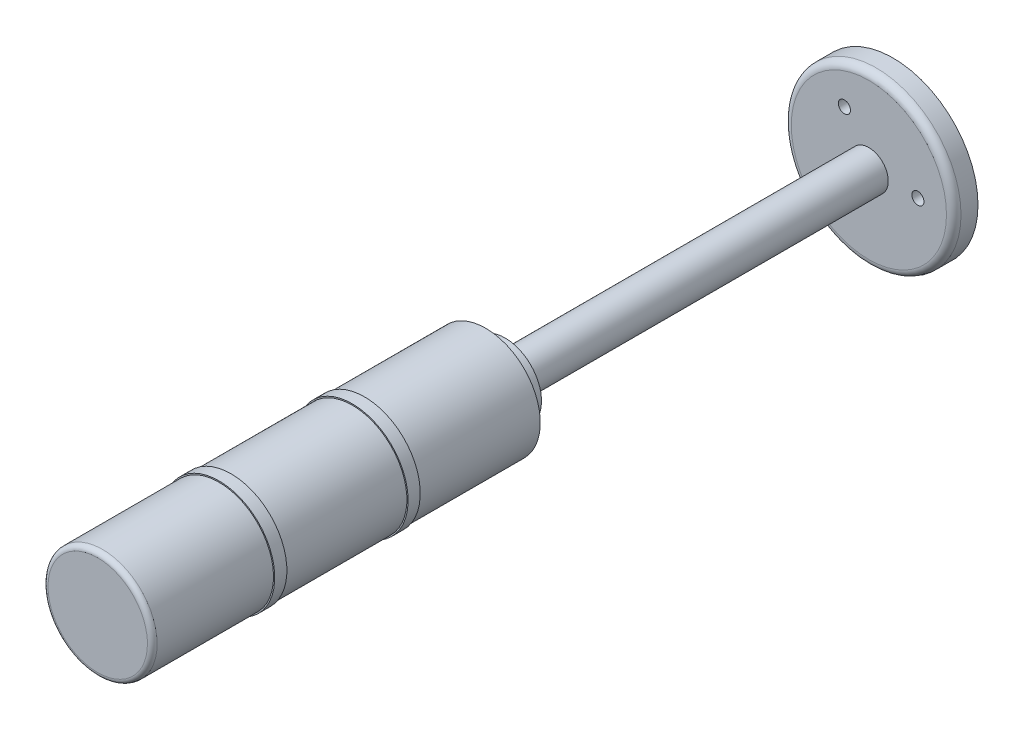
ISO-10303-21;
HEADER;
FILE_DESCRIPTION(('STEP AP214'),'2;1');
FILE_NAME('part.step','',(''),(''),'','','');
FILE_SCHEMA(('AUTOMOTIVE_DESIGN { 1 0 10303 214 1 1 1 1 }'));
ENDSEC;
DATA;
#1=APPLICATION_CONTEXT('core data for automotive mechanical design processes');
#2=APPLICATION_PROTOCOL_DEFINITION('international standard','automotive_design',2000,#1);
#3=PRODUCT_CONTEXT('',#1,'mechanical');
#4=PRODUCT('Part','Part','',(#3));
#5=PRODUCT_RELATED_PRODUCT_CATEGORY('part','',(#4));
#6=PRODUCT_DEFINITION_FORMATION('','',#4);
#7=PRODUCT_DEFINITION_CONTEXT('part definition',#1,'design');
#8=PRODUCT_DEFINITION('design','',#6,#7);
#9=PRODUCT_DEFINITION_SHAPE('','',#8);
#10=(LENGTH_UNIT() NAMED_UNIT(*) SI_UNIT(.MILLI.,.METRE.));
#11=(NAMED_UNIT(*) PLANE_ANGLE_UNIT() SI_UNIT($,.RADIAN.));
#12=(NAMED_UNIT(*) SI_UNIT($,.STERADIAN.) SOLID_ANGLE_UNIT());
#13=UNCERTAINTY_MEASURE_WITH_UNIT(LENGTH_MEASURE(1.E-05),#10,'distance_accuracy_value','');
#14=(GEOMETRIC_REPRESENTATION_CONTEXT(3) GLOBAL_UNCERTAINTY_ASSIGNED_CONTEXT((#13)) GLOBAL_UNIT_ASSIGNED_CONTEXT((#10,
#11,#12)) REPRESENTATION_CONTEXT('',''));
#15=CARTESIAN_POINT('',(0.,0.,0.));
#16=DIRECTION('',(0.,0.,1.));
#17=DIRECTION('',(1.,0.,0.));
#18=AXIS2_PLACEMENT_3D('',#15,#16,#17);
#19=CARTESIAN_POINT('',(0.,0.,-268.));
#20=DIRECTION('',(0.,0.,-1.));
#21=DIRECTION('',(-1.,0.,0.));
#22=AXIS2_PLACEMENT_3D('',#19,#20,#21);
#23=PLANE('',#22);
#24=CARTESIAN_POINT('',(-10.1036297108185,17.5,-268.));
#25=DIRECTION('',(0.,0.,-1.));
#26=DIRECTION('',(-1.,0.,0.));
#27=AXIS2_PLACEMENT_3D('',#24,#25,#26);
#28=CIRCLE('',#27,2.5);
#29=CARTESIAN_POINT('',(-12.6036297108185,17.5,-268.));
#30=VERTEX_POINT('',#29);
#31=EDGE_CURVE('E325',#30,#30,#28,.T.);
#32=ORIENTED_EDGE('',*,*,#31,.T.);
#33=EDGE_LOOP('',(#32));
#34=FACE_BOUND('',#33,.T.);
#35=CARTESIAN_POINT('',(-10.1036297108184,-17.5,-268.));
#36=DIRECTION('',(0.,0.,-1.));
#37=DIRECTION('',(-1.,0.,0.));
#38=AXIS2_PLACEMENT_3D('',#35,#36,#37);
#39=CIRCLE('',#38,2.5);
#40=CARTESIAN_POINT('',(-12.6036297108184,-17.5,-268.));
#41=VERTEX_POINT('',#40);
#42=EDGE_CURVE('E217',#41,#41,#39,.T.);
#43=ORIENTED_EDGE('',*,*,#42,.T.);
#44=EDGE_LOOP('',(#43));
#45=FACE_BOUND('',#44,.T.);
#46=CARTESIAN_POINT('',(20.2072594216369,0.,-268.));
#47=DIRECTION('',(0.,0.,-1.));
#48=DIRECTION('',(-1.,0.,0.));
#49=AXIS2_PLACEMENT_3D('',#46,#47,#48);
#50=CIRCLE('',#49,2.5);
#51=CARTESIAN_POINT('',(17.7072594216369,0.,-268.));
#52=VERTEX_POINT('',#51);
#53=EDGE_CURVE('E205',#52,#52,#50,.T.);
#54=ORIENTED_EDGE('',*,*,#53,.T.);
#55=EDGE_LOOP('',(#54));
#56=FACE_BOUND('',#55,.T.);
#57=CARTESIAN_POINT('',(0.,0.,-268.));
#58=DIRECTION('',(0.,0.,-1.));
#59=DIRECTION('',(-1.,0.,0.));
#60=AXIS2_PLACEMENT_3D('',#57,#58,#59);
#61=CIRCLE('',#60,8.);
#62=CARTESIAN_POINT('',(-8.,0.,-268.));
#63=VERTEX_POINT('',#62);
#64=EDGE_CURVE('E166',#63,#63,#61,.F.);
#65=ORIENTED_EDGE('',*,*,#64,.F.);
#66=EDGE_LOOP('',(#65));
#67=FACE_BOUND('',#66,.T.);
#68=CARTESIAN_POINT('',(0.,0.,-268.));
#69=DIRECTION('',(0.,0.,-1.));
#70=DIRECTION('',(-1.,0.,0.));
#71=AXIS2_PLACEMENT_3D('',#68,#69,#70);
#72=CIRCLE('',#71,32.);
#73=CARTESIAN_POINT('',(-32.,0.,-268.));
#74=VERTEX_POINT('',#73);
#75=CARTESIAN_POINT('',(32.,0.,-268.));
#76=VERTEX_POINT('',#75);
#77=EDGE_CURVE('E59',#74,#76,#72,.T.);
#78=ORIENTED_EDGE('',*,*,#77,.F.);
#79=CARTESIAN_POINT('',(0.,0.,-268.));
#80=DIRECTION('',(0.,0.,-1.));
#81=DIRECTION('',(1.,0.,0.));
#82=AXIS2_PLACEMENT_3D('',#79,#80,#81);
#83=CIRCLE('',#82,32.);
#84=EDGE_CURVE('E55',#76,#74,#83,.T.);
#85=ORIENTED_EDGE('',*,*,#84,.F.);
#86=EDGE_LOOP('',(#78,#85));
#87=FACE_BOUND('',#86,.T.);
#88=ADVANCED_FACE('F38',(#34,#45,#56,#67,#87),#23,.F.);
#89=CARTESIAN_POINT('',(0.,0.,-271.));
#90=DIRECTION('',(0.,0.,-1.));
#91=DIRECTION('',(-1.,0.,0.));
#92=AXIS2_PLACEMENT_3D('',#89,#90,#91);
#93=TOROIDAL_SURFACE('',#92,32.,3.);
#94=CARTESIAN_POINT('',(0.,0.,-271.));
#95=DIRECTION('',(0.,0.,1.));
#96=DIRECTION('',(1.,0.,0.));
#97=AXIS2_PLACEMENT_3D('',#94,#95,#96);
#98=CIRCLE('',#97,35.);
#99=CARTESIAN_POINT('',(35.,0.,-271.));
#100=VERTEX_POINT('',#99);
#101=EDGE_CURVE('E48',#100,#100,#98,.F.);
#102=ORIENTED_EDGE('',*,*,#101,.F.);
#103=EDGE_LOOP('',(#102));
#104=FACE_BOUND('',#103,.T.);
#105=ORIENTED_EDGE('',*,*,#77,.T.);
#106=ORIENTED_EDGE('',*,*,#84,.T.);
#107=EDGE_LOOP('',(#105,#106));
#108=FACE_BOUND('',#107,.T.);
#109=ADVANCED_FACE('F238',(#104,#108),#93,.T.);
#110=CARTESIAN_POINT('',(0.,0.,-278.));
#111=DIRECTION('',(0.,0.,1.));
#112=DIRECTION('',(1.,0.,0.));
#113=AXIS2_PLACEMENT_3D('',#110,#111,#112);
#114=CYLINDRICAL_SURFACE('',#113,35.);
#115=ORIENTED_EDGE('',*,*,#101,.T.);
#116=EDGE_LOOP('',(#115));
#117=FACE_BOUND('',#116,.T.);
#118=CARTESIAN_POINT('',(0.,0.,-278.));
#119=DIRECTION('',(0.,0.,1.));
#120=DIRECTION('',(1.,0.,0.));
#121=AXIS2_PLACEMENT_3D('',#118,#119,#120);
#122=CIRCLE('',#121,35.);
#123=CARTESIAN_POINT('',(35.,0.,-278.));
#124=VERTEX_POINT('',#123);
#125=EDGE_CURVE('E11',#124,#124,#122,.F.);
#126=ORIENTED_EDGE('',*,*,#125,.F.);
#127=EDGE_LOOP('',(#126));
#128=FACE_BOUND('',#127,.T.);
#129=ADVANCED_FACE('F233',(#117,#128),#114,.T.);
#130=CARTESIAN_POINT('',(0.,0.,-278.));
#131=DIRECTION('',(0.,0.,-1.));
#132=DIRECTION('',(-1.,0.,0.));
#133=AXIS2_PLACEMENT_3D('',#130,#131,#132);
#134=PLANE('',#133);
#135=CARTESIAN_POINT('',(-10.1036297108185,17.5,-278.));
#136=DIRECTION('',(0.,0.,-1.));
#137=DIRECTION('',(-1.,0.,0.));
#138=AXIS2_PLACEMENT_3D('',#135,#136,#137);
#139=CIRCLE('',#138,2.5);
#140=CARTESIAN_POINT('',(-12.6036297108185,17.5,-278.));
#141=VERTEX_POINT('',#140);
#142=EDGE_CURVE('E214',#141,#141,#139,.T.);
#143=ORIENTED_EDGE('',*,*,#142,.F.);
#144=EDGE_LOOP('',(#143));
#145=FACE_BOUND('',#144,.T.);
#146=CARTESIAN_POINT('',(-10.1036297108184,-17.5,-278.));
#147=DIRECTION('',(0.,0.,-1.));
#148=DIRECTION('',(-1.,0.,0.));
#149=AXIS2_PLACEMENT_3D('',#146,#147,#148);
#150=CIRCLE('',#149,2.5);
#151=CARTESIAN_POINT('',(-12.6036297108184,-17.5,-278.));
#152=VERTEX_POINT('',#151);
#153=EDGE_CURVE('E246',#152,#152,#150,.T.);
#154=ORIENTED_EDGE('',*,*,#153,.F.);
#155=EDGE_LOOP('',(#154));
#156=FACE_BOUND('',#155,.T.);
#157=CARTESIAN_POINT('',(20.2072594216369,0.,-278.));
#158=DIRECTION('',(0.,0.,-1.));
#159=DIRECTION('',(-1.,0.,0.));
#160=AXIS2_PLACEMENT_3D('',#157,#158,#159);
#161=CIRCLE('',#160,2.5);
#162=CARTESIAN_POINT('',(17.7072594216369,0.,-278.));
#163=VERTEX_POINT('',#162);
#164=EDGE_CURVE('E209',#163,#163,#161,.T.);
#165=ORIENTED_EDGE('',*,*,#164,.F.);
#166=EDGE_LOOP('',(#165));
#167=FACE_BOUND('',#166,.T.);
#168=ORIENTED_EDGE('',*,*,#125,.T.);
#169=EDGE_LOOP('',(#168));
#170=FACE_BOUND('',#169,.T.);
#171=ADVANCED_FACE('F150',(#145,#156,#167,#170),#134,.T.);
#172=CARTESIAN_POINT('',(0.,0.,50.));
#173=DIRECTION('',(0.,0.,-1.));
#174=DIRECTION('',(-1.,0.,0.));
#175=AXIS2_PLACEMENT_3D('',#172,#173,#174);
#176=PLANE('',#175);
#177=CARTESIAN_POINT('',(0.,0.,50.));
#178=DIRECTION('',(0.,0.,-1.));
#179=DIRECTION('',(0.,1.,0.));
#180=AXIS2_PLACEMENT_3D('',#177,#178,#179);
#181=CIRCLE('',#180,20.5);
#182=CARTESIAN_POINT('',(20.5,0.,50.));
#183=VERTEX_POINT('',#182);
#184=CARTESIAN_POINT('',(-20.5,0.,50.));
#185=VERTEX_POINT('',#184);
#186=EDGE_CURVE('E165',#183,#185,#181,.T.);
#187=ORIENTED_EDGE('',*,*,#186,.F.);
#188=CARTESIAN_POINT('',(-20.5,0.,50.));
#189=CARTESIAN_POINT('',(-20.5000032077772,0.274828723634129,50.));
#190=CARTESIAN_POINT('',(-20.4944734736397,0.549657223690522,50.));
#191=CARTESIAN_POINT('',(-20.4723711507077,1.09886985360395,50.));
#192=CARTESIAN_POINT('',(-20.4557985619132,1.37325398346099,50.));
#193=CARTESIAN_POINT('',(-20.4116335588393,1.92113394993181,50.));
#194=CARTESIAN_POINT('',(-20.3840411445601,2.1946297865456,50.));
#195=CARTESIAN_POINT('',(-20.3178821280162,2.74029087272713,50.));
#196=CARTESIAN_POINT('',(-20.2793155257516,3.01245612229487,50.));
#197=CARTESIAN_POINT('',(-20.1912702373858,3.5550158409908,50.));
#198=CARTESIAN_POINT('',(-20.1417915512845,3.825410310119,50.));
#199=CARTESIAN_POINT('',(-20.0320021914943,4.36399115230005,50.));
#200=CARTESIAN_POINT('',(-19.9716915178053,4.63217752535291,50.));
#201=CARTESIAN_POINT('',(-19.8403357059354,5.16590842732852,50.));
#202=CARTESIAN_POINT('',(-19.7692905677544,5.43145295625128,50.));
#203=CARTESIAN_POINT('',(-19.6165807360656,5.95947069545172,50.));
#204=CARTESIAN_POINT('',(-19.5349160425578,6.2219439057294,50.));
#205=CARTESIAN_POINT('',(-19.3610991775133,6.74339450096095,50.));
#206=CARTESIAN_POINT('',(-19.2689470059765,7.00237188591481,50.));
#207=CARTESIAN_POINT('',(-19.0743042281013,7.51641197501478,50.));
#208=CARTESIAN_POINT('',(-18.9718136217628,7.77147467916089,50.));
#209=CARTESIAN_POINT('',(-18.7566597288386,8.27727289293835,50.));
#210=CARTESIAN_POINT('',(-18.6439964422529,8.5280084025697,50.));
#211=CARTESIAN_POINT('',(-18.4086794294216,9.0247466731623,50.));
#212=CARTESIAN_POINT('',(-18.286025703176,9.27074943412356,50.));
#213=CARTESIAN_POINT('',(-18.0309260853053,9.7576244531303,50.));
#214=CARTESIAN_POINT('',(-17.8984801936801,9.99849671117579,50.));
#215=CARTESIAN_POINT('',(-17.6240108199445,10.4747207249517,50.));
#216=CARTESIAN_POINT('',(-17.4819873378341,10.7100724806822,50.));
#217=CARTESIAN_POINT('',(-17.1885911188036,11.174876445055,50.));
#218=CARTESIAN_POINT('',(-17.0372183818835,11.4043286536974,50.));
#219=CARTESIAN_POINT('',(-16.7253735639712,11.8569564590755,50.));
#220=CARTESIAN_POINT('',(-16.5649014829789,12.0801320558112,50.));
#221=CARTESIAN_POINT('',(-16.1758712570817,12.5988373727686,50.));
#222=CARTESIAN_POINT('',(-15.9435599186384,12.8915643985854,50.));
#223=CARTESIAN_POINT('',(-15.4632964892471,13.4638785036779,50.));
#224=CARTESIAN_POINT('',(-15.2153443982989,13.7434655829538,50.));
#225=CARTESIAN_POINT('',(-14.7045321879936,14.2886764162054,50.));
#226=CARTESIAN_POINT('',(-14.4416720686364,14.5543001701812,50.0000000000001));
#227=CARTESIAN_POINT('',(-13.9018312092124,15.0707875417324,49.9999999999998));
#228=CARTESIAN_POINT('',(-13.6248504691455,15.321651159308,49.9999999999994));
#229=CARTESIAN_POINT('',(-13.0575958425492,15.8078695376692,50.0000000000006));
#230=CARTESIAN_POINT('',(-12.7673219560197,16.0432242984549,50.0000000000021));
#231=CARTESIAN_POINT('',(-12.1743465756122,16.4977217673589,49.9999999999979));
#232=CARTESIAN_POINT('',(-11.8716450817341,16.7168644754773,49.999999999992));
#233=CARTESIAN_POINT('',(-11.2547258865903,17.1382823390832,50.000000000008));
#234=CARTESIAN_POINT('',(-10.9405081853245,17.3405574945708,50.0000000000298));
#235=CARTESIAN_POINT('',(-10.3014691145297,17.7276389288622,49.9999999999702));
#236=CARTESIAN_POINT('',(-9.97664774500056,17.912445207666,49.9999999998889));
#237=CARTESIAN_POINT('',(-9.46525113454908,18.1852045405983,50.0000000000612));
#238=CARTESIAN_POINT('',(-9.28199275524056,18.2794303029593,50.000000000181));
#239=CARTESIAN_POINT('',(-8.91272512287839,18.4623418606966,49.9999999992401));
#240=CARTESIAN_POINT('',(-8.72671586766524,18.5510276517235,49.9999999981793));
#241=CARTESIAN_POINT('',(-8.35211632892393,18.7227675994613,49.9999999925581));
#242=CARTESIAN_POINT('',(-8.16352603477328,18.8058217329863,49.9999999879976));
#243=CARTESIAN_POINT('',(-7.78393836090987,18.9662394131278,49.9999999651106));
#244=CARTESIAN_POINT('',(-7.59294096327831,19.0436029173532,49.999999946784));
#245=CARTESIAN_POINT('',(-7.20864769647201,19.1925352504815,49.9999999050103));
#246=CARTESIAN_POINT('',(-7.01535129901719,19.2641027168292,49.999999881562));
#247=CARTESIAN_POINT('',(-6.62666099115838,19.4012913515675,49.9999998631055));
#248=CARTESIAN_POINT('',(-6.43126708988929,19.4669125458431,49.9999998680971));
#249=CARTESIAN_POINT('',(-6.03858262834651,19.5922024957703,49.9999999002964));
#250=CARTESIAN_POINT('',(-5.84129209505342,19.6518713359602,49.9999999275037));
#251=CARTESIAN_POINT('',(-5.44495424004429,19.7650437820955,49.9999999746393));
#252=CARTESIAN_POINT('',(-5.24590696070338,19.818547536316,49.9999999945679));
#253=CARTESIAN_POINT('',(-4.92995833050387,19.8987129847978,50.0000000031598));
#254=CARTESIAN_POINT('',(-4.81352398152376,19.9272408210878,50.0000000014145));
#255=CARTESIAN_POINT('',(-4.39924743496073,20.0248977566581,49.9999999937948));
#256=CARTESIAN_POINT('',(-4.10004821342178,20.0883962774833,49.9999999857138));
#257=CARTESIAN_POINT('',(-3.57511383745618,20.1875841270118,49.9999999544758));
#258=CARTESIAN_POINT('',(-3.34993154995245,20.2262453779905,49.9999999356472));
#259=CARTESIAN_POINT('',(-2.93086266333279,20.2909506103735,49.9999999121864));
#260=CARTESIAN_POINT('',(-2.73713291855902,20.3180095346011,49.9999999059018));
#261=CARTESIAN_POINT('',(-2.33222578352696,20.3686330098142,49.9999999044886));
#262=CARTESIAN_POINT('',(-2.12098535990785,20.3916945417268,49.9999999103695));
#263=CARTESIAN_POINT('',(-1.69788991160972,20.4312137382261,49.999999926598));
#264=CARTESIAN_POINT('',(-1.48603489114465,20.4476714479842,49.9999999369456));
#265=CARTESIAN_POINT('',(-1.06191755345181,20.4739892469356,49.9999999602208));
#266=CARTESIAN_POINT('',(-0.849655240474451,20.4838494046077,49.9999999731484));
#267=CARTESIAN_POINT('',(-0.424925184543616,20.4968607422733,49.9999999922236));
#268=CARTESIAN_POINT('',(-0.212457444490631,20.5000120156467,49.9999999983713));
#269=CARTESIAN_POINT('',(0.134705517870294,20.4999923816559,50.0000000010327));
#270=CARTESIAN_POINT('',(0.269406896916787,20.4987131187482,50.0000000002487));
#271=CARTESIAN_POINT('',(0.755579642915981,20.489294920074,49.9999999925136));
#272=CARTESIAN_POINT('',(1.10695085586471,20.4734286415252,49.999999977666));
#273=CARTESIAN_POINT('',(1.64859525076813,20.4349806191714,49.9999999433125));
#274=CARTESIAN_POINT('',(1.83935295782587,20.4187487826278,49.9999999290082));
#275=CARTESIAN_POINT('',(2.20870211403035,20.3820655053141,49.9999999099965));
#276=CARTESIAN_POINT('',(2.38732463455837,20.3619325618015,49.9999999047559));
#277=CARTESIAN_POINT('',(2.67807528325516,20.3252501096892,49.9999999067523));
#278=CARTESIAN_POINT('',(2.79038643619531,20.3101251528363,49.9999999100945));
#279=CARTESIAN_POINT('',(3.20105329237853,20.2513404446318,49.9999999241818));
#280=CARTESIAN_POINT('',(3.49861237744467,20.2020082042121,49.9999999380035));
#281=CARTESIAN_POINT('',(4.20980623642071,20.0679218741887,49.9999999645577));
#282=CARTESIAN_POINT('',(4.62227651637203,19.9768917171022,49.9999999746444));
#283=CARTESIAN_POINT('',(5.2653426150271,19.8139648122684,49.9999999886738));
#284=CARTESIAN_POINT('',(5.49813454348757,19.7505845085566,49.9999999933971));
#285=CARTESIAN_POINT('',(5.89913030490617,19.6338084919181,49.9999999960999));
#286=CARTESIAN_POINT('',(6.06788503529909,19.5823045328056,49.9999999955503));
#287=CARTESIAN_POINT('',(6.4080209844901,19.4737179828495,49.9999999961938));
#288=CARTESIAN_POINT('',(6.57936910314148,19.4165317822472,49.9999999974288));
#289=CARTESIAN_POINT('',(6.92053373558802,19.2977491973878,49.9999999683128));
#290=CARTESIAN_POINT('',(7.09035024470948,19.236152799678,49.9999999379619));
#291=CARTESIAN_POINT('',(7.41954811621219,19.1116224060262,49.9999999148648));
#292=CARTESIAN_POINT('',(7.57901731391993,19.0489197697977,49.9999999202667));
#293=CARTESIAN_POINT('',(8.07664383473635,18.8459676540796,49.9999999456258));
#294=CARTESIAN_POINT('',(8.41192265922765,18.6985685686552,49.999999975148));
#295=CARTESIAN_POINT('',(8.99344806092915,18.4241843876349,49.9999999978121));
#296=CARTESIAN_POINT('',(9.24148885181878,18.3009720538592,49.9999999980639));
#297=CARTESIAN_POINT('',(9.6956793454472,18.0638470184416,49.9999999979924));
#298=CARTESIAN_POINT('',(9.90254338411287,17.9513017788372,49.9999999977495));
#299=CARTESIAN_POINT('',(10.3421233215506,17.7022730275952,49.999999992629));
#300=CARTESIAN_POINT('',(10.5742181959246,17.564689905821,49.9999999870818));
#301=CARTESIAN_POINT('',(10.9432732668004,17.3359609070329,49.9999999723168));
#302=CARTESIAN_POINT('',(11.0820016158597,17.24765409761,49.9999999653774));
#303=CARTESIAN_POINT('',(11.3572835625641,17.0677158267467,49.9999999533205));
#304=CARTESIAN_POINT('',(11.4938371519497,16.9760843526837,49.999999948203));
#305=CARTESIAN_POINT('',(11.945251431919,16.6652024289193,49.999999935726));
#306=CARTESIAN_POINT('',(12.255138952575,16.4386648709921,49.9999999344721));
#307=CARTESIAN_POINT('',(12.8616649788128,15.9685158057519,49.999999948924));
#308=CARTESIAN_POINT('',(13.1583035568111,15.7249043917806,49.9999999646298));
#309=CARTESIAN_POINT('',(13.6132656473822,15.3292625634778,49.9999999875718));
#310=CARTESIAN_POINT('',(13.7763875750414,15.1827228789596,49.9999999955533));
#311=CARTESIAN_POINT('',(13.9754977295831,14.9980361873327,49.9999999988554));
#312=CARTESIAN_POINT('',(14.0137331085281,14.9622989835557,49.9999999991889));
#313=CARTESIAN_POINT('',(14.2225677697052,14.765621037088,50.0000000005853));
#314=CARTESIAN_POINT('',(14.3905858675236,14.601913272923,50.0000000001467));
#315=CARTESIAN_POINT('',(14.6798751491455,14.3101976490435,49.9999999998455));
#316=CARTESIAN_POINT('',(14.8023934858394,14.1834201810036,49.9999999998668));
#317=CARTESIAN_POINT('',(15.0711018118588,13.8981036619666,49.9999999998664));
#318=CARTESIAN_POINT('',(15.2164722750892,13.7387907685392,49.999999999834));
#319=CARTESIAN_POINT('',(15.5281735126316,13.3861809911688,49.9999999998339));
#320=CARTESIAN_POINT('',(15.693489363177,13.1919869663926,49.9999999998792));
#321=CARTESIAN_POINT('',(16.0417124948859,12.7671269237686,49.9999999999635));
#322=CARTESIAN_POINT('',(16.2233984968749,12.5354565446945,50.0000000000005));
#323=CARTESIAN_POINT('',(16.4824531775345,12.1900680915065,49.9999999999997));
#324=CARTESIAN_POINT('',(16.5637980121347,12.0793108568547,49.9999999999913));
#325=CARTESIAN_POINT('',(16.724244428711,11.8561826131055,49.9999999999601));
#326=CARTESIAN_POINT('',(16.803346009643,11.7438116032568,49.9999999999373));
#327=CARTESIAN_POINT('',(17.0372352653502,11.4043482450061,49.9999999998522));
#328=CARTESIAN_POINT('',(17.1886156907139,11.1748945846052,49.9999999997733));
#329=CARTESIAN_POINT('',(17.4820231286016,10.7100922015396,49.999999999592));
#330=CARTESIAN_POINT('',(17.6240501341595,10.4747434744847,49.9999999994896));
#331=CARTESIAN_POINT('',(17.8985269512047,9.99852337181152,49.9999999992792));
#332=CARTESIAN_POINT('',(18.030976756748,9.75765199276585,49.9999999991711));
#333=CARTESIAN_POINT('',(18.2860832915635,9.27077846349714,49.9999999989639));
#334=CARTESIAN_POINT('',(18.4087400159734,9.02477631072674,49.9999999988647));
#335=CARTESIAN_POINT('',(18.6440623862123,8.5280385923487,49.9999999986866));
#336=CARTESIAN_POINT('',(18.7567280283209,8.2773030249785,49.9999999986077));
#337=CARTESIAN_POINT('',(18.9718858511689,7.77150425044775,49.9999999984782));
#338=CARTESIAN_POINT('',(19.0743780293828,7.51644104221288,49.9999999984276));
#339=CARTESIAN_POINT('',(19.2690231479938,7.00239955870717,49.9999999983596));
#340=CARTESIAN_POINT('',(19.3611760871076,6.74342128295037,49.9999999983422));
#341=CARTESIAN_POINT('',(19.5349936397897,6.22196862601541,49.9999999983422));
#342=CARTESIAN_POINT('',(19.6166582533582,5.95949424483725,49.9999999983596));
#343=CARTESIAN_POINT('',(19.7693670490951,5.43147398085266,49.9999999984276));
#344=CARTESIAN_POINT('',(19.8404112325819,5.16592809842748,49.9999999984782));
#345=CARTESIAN_POINT('',(19.9717642362657,4.63219440892538,49.9999999986077));
#346=CARTESIAN_POINT('',(20.0320730591277,4.36400660250434,49.9999999986866));
#347=CARTESIAN_POINT('',(20.1418578044661,3.82542291634679,49.9999999988647));
#348=CARTESIAN_POINT('',(20.1913337309763,3.55502703743255,49.9999999989639));
#349=CARTESIAN_POINT('',(20.2793725814307,3.01246462654392,49.9999999991711));
#350=CARTESIAN_POINT('',(20.3179355107933,2.74029809544872,49.9999999992792));
#351=CARTESIAN_POINT('',(20.3840862652757,2.19463467873328,49.9999999994896));
#352=CARTESIAN_POINT('',(20.411674097207,1.9211377939388,49.999999999592));
#353=CARTESIAN_POINT('',(20.4558290299324,1.373256068733,49.9999999997734));
#354=CARTESIAN_POINT('',(20.4723961389343,1.09887122898315,49.9999999998524));
#355=CARTESIAN_POINT('',(20.4944866163143,0.549657621703544,49.9999999999654));
#356=CARTESIAN_POINT('',(20.5000099942879,0.274828854559721,49.9999999999994));
#357=CARTESIAN_POINT('',(20.5,0.,50.));
#358=B_SPLINE_CURVE_WITH_KNOTS('',3,(#188,#189,#190,#191,#192,#193,#194,#195,#196,#197,#198,
#199,#200,#201,#202,#203,#204,#205,#206,#207,#208,#209,#210,#211,#212,#213,#214,#215,#216,#217,
#218,#219,#220,#221,#222,#223,#224,#225,#226,#227,#228,#229,#230,#231,#232,#233,#234,#235,#236,
#237,#238,#239,#240,#241,#242,#243,#244,#245,#246,#247,#248,#249,#250,#251,#252,#253,#254,#255,
#256,#257,#258,#259,#260,#261,#262,#263,#264,#265,#266,#267,#268,#269,#270,#271,#272,#273,#274,
#275,#276,#277,#278,#279,#280,#281,#282,#283,#284,#285,#286,#287,#288,#289,#290,#291,#292,#293,
#294,#295,#296,#297,#298,#299,#300,#301,#302,#303,#304,#305,#306,#307,#308,#309,#310,#311,#312,
#313,#314,#315,#316,#317,#318,#319,#320,#321,#322,#323,#324,#325,#326,#327,#328,#329,#330,#331,
#332,#333,#334,#335,#336,#337,#338,#339,#340,#341,#342,#343,#344,#345,#346,#347,#348,#349,#350,
#351,#352,#353,#354,#355,#356,#357),.UNSPECIFIED.,.F.,.F.,(4,2,2,2,2,2,2,2,2,2,2,2,2,2,2,2,2,2,
2,2,2,2,2,2,2,2,2,2,2,2,2,2,2,2,2,2,2,2,2,2,2,2,2,2,2,2,2,2,2,2,2,2,2,2,2,2,2,2,2,2,2,2,2,2,2,2,
2,2,2,2,2,2,2,2,2,2,2,2,2,2,2,2,2,2,4),(0.,0.824430228022319,1.64886045604464,2.47329068406694,
3.29772091208928,4.12215114011156,4.94658136813388,5.7710115961562,6.59544182417852,
7.41987205220084,8.24430228022316,9.06873250824547,9.89316273626776,10.7175929642901,
11.5420231923124,12.3664534203347,13.190883648357,14.3114224530573,15.4319612577575,
16.5525000624578,17.6730388671581,18.7935776718583,19.9141164765586,21.0346552812588,
22.1551940859591,22.7733051850398,23.3914167693785,24.0095308983754,24.6276496314144,
25.2459132549511,25.8641741869595,26.4824263368578,27.1006636142095,27.4602895424356,
28.3775191146075,29.0628328949887,29.6495830769635,30.2869646384277,30.924341840008,
31.5617124258774,32.199074140229,32.603183960943,33.6577995485935,34.232083898476,
34.7712718291753,35.1112357803083,36.0158053605218,37.2820938400117,38.0057592544079,
38.5350186083151,39.0768764042781,39.6187358531616,40.1327527745442,41.2308995644091,
42.0615632971138,42.767924326633,43.5771247430086,44.0704288788427,44.5637348877755,
45.7146602040451,46.865579228763,47.5232985346802,47.6803075026091,48.3838975846517,
48.9127612370051,49.5596568740608,50.3245794301896,51.2075230404998,51.6197590915278,
52.0319953344388,52.8564266627848,53.6808586051251,54.5052910591274,55.3297239224593,
56.1541570927885,56.9785904677824,57.8030239451088,58.6274574224351,59.4518907974291,
60.2763239677582,61.1007568310901,61.9251892850925,62.7496212274328,63.5740525557787,
64.3984831677978),.UNSPECIFIED.);
#359=EDGE_CURVE('E159',#185,#183,#358,.T.);
#360=ORIENTED_EDGE('',*,*,#359,.F.);
#361=EDGE_LOOP('',(#187,#360));
#362=FACE_BOUND('',#361,.T.);
#363=ADVANCED_FACE('F147',(#362),#176,.F.);
#364=CARTESIAN_POINT('',(0.,0.,48.));
#365=DIRECTION('',(0.,0.,-1.));
#366=DIRECTION('',(0.,1.,0.));
#367=AXIS2_PLACEMENT_3D('',#364,#365,#366);
#368=TOROIDAL_SURFACE('',#367,20.5,2.00000000000001);
#369=CARTESIAN_POINT('',(0.,0.,48.));
#370=DIRECTION('',(0.,0.,1.));
#371=DIRECTION('',(1.,0.,0.));
#372=AXIS2_PLACEMENT_3D('',#369,#370,#371);
#373=CIRCLE('',#372,22.5);
#374=CARTESIAN_POINT('',(22.5,0.,48.));
#375=VERTEX_POINT('',#374);
#376=EDGE_CURVE('E164',#375,#375,#373,.F.);
#377=ORIENTED_EDGE('',*,*,#376,.F.);
#378=EDGE_LOOP('',(#377));
#379=FACE_BOUND('',#378,.T.);
#380=ORIENTED_EDGE('',*,*,#359,.T.);
#381=ORIENTED_EDGE('',*,*,#186,.T.);
#382=EDGE_LOOP('',(#380,#381));
#383=FACE_BOUND('',#382,.T.);
#384=ADVANCED_FACE('F145',(#379,#383),#368,.T.);
#385=CARTESIAN_POINT('',(0.,0.,0.));
#386=DIRECTION('',(0.,0.,1.));
#387=DIRECTION('',(1.,0.,0.));
#388=AXIS2_PLACEMENT_3D('',#385,#386,#387);
#389=CYLINDRICAL_SURFACE('',#388,22.5);
#390=ORIENTED_EDGE('',*,*,#376,.T.);
#391=EDGE_LOOP('',(#390));
#392=FACE_BOUND('',#391,.T.);
#393=CARTESIAN_POINT('',(0.,0.,0.));
#394=DIRECTION('',(0.,0.,1.));
#395=DIRECTION('',(1.,0.,0.));
#396=AXIS2_PLACEMENT_3D('',#393,#394,#395);
#397=CIRCLE('',#396,22.5);
#398=CARTESIAN_POINT('',(22.5,0.,0.));
#399=VERTEX_POINT('',#398);
#400=EDGE_CURVE('E203',#399,#399,#397,.F.);
#401=ORIENTED_EDGE('',*,*,#400,.F.);
#402=EDGE_LOOP('',(#401));
#403=FACE_BOUND('',#402,.T.);
#404=ADVANCED_FACE('F141',(#392,#403),#389,.T.);
#405=CARTESIAN_POINT('',(0.,0.,0.));
#406=DIRECTION('',(0.,0.,1.));
#407=DIRECTION('',(1.,0.,0.));
#408=AXIS2_PLACEMENT_3D('',#405,#406,#407);
#409=PLANE('',#408);
#410=CARTESIAN_POINT('',(0.,0.,0.));
#411=DIRECTION('',(0.,0.,-1.));
#412=DIRECTION('',(-1.,0.,0.));
#413=AXIS2_PLACEMENT_3D('',#410,#411,#412);
#414=CIRCLE('',#413,23.);
#415=CARTESIAN_POINT('',(-23.,0.,0.));
#416=VERTEX_POINT('',#415);
#417=EDGE_CURVE('E200',#416,#416,#414,.T.);
#418=ORIENTED_EDGE('',*,*,#417,.F.);
#419=EDGE_LOOP('',(#418));
#420=FACE_BOUND('',#419,.T.);
#421=ORIENTED_EDGE('',*,*,#400,.T.);
#422=EDGE_LOOP('',(#421));
#423=FACE_BOUND('',#422,.T.);
#424=ADVANCED_FACE('F137',(#420,#423),#409,.T.);
#425=CARTESIAN_POINT('',(0.,0.,0.));
#426=DIRECTION('',(0.,0.,-1.));
#427=DIRECTION('',(-1.,0.,0.));
#428=AXIS2_PLACEMENT_3D('',#425,#426,#427);
#429=CYLINDRICAL_SURFACE('',#428,23.);
#430=ORIENTED_EDGE('',*,*,#417,.T.);
#431=EDGE_LOOP('',(#430));
#432=FACE_BOUND('',#431,.T.);
#433=CARTESIAN_POINT('',(0.,0.,-5.));
#434=DIRECTION('',(0.,0.,-1.));
#435=DIRECTION('',(-1.,0.,0.));
#436=AXIS2_PLACEMENT_3D('',#433,#434,#435);
#437=CIRCLE('',#436,23.);
#438=CARTESIAN_POINT('',(-23.,0.,-5.));
#439=VERTEX_POINT('',#438);
#440=EDGE_CURVE('E197',#439,#439,#437,.F.);
#441=ORIENTED_EDGE('',*,*,#440,.T.);
#442=EDGE_LOOP('',(#441));
#443=FACE_BOUND('',#442,.T.);
#444=ADVANCED_FACE('F133',(#432,#443),#429,.T.);
#445=CARTESIAN_POINT('',(0.,0.,-5.));
#446=DIRECTION('',(0.,0.,1.));
#447=DIRECTION('',(1.,0.,0.));
#448=AXIS2_PLACEMENT_3D('',#445,#446,#447);
#449=PLANE('',#448);
#450=ORIENTED_EDGE('',*,*,#440,.F.);
#451=EDGE_LOOP('',(#450));
#452=FACE_BOUND('',#451,.T.);
#453=CARTESIAN_POINT('',(0.,0.,-5.));
#454=DIRECTION('',(0.,0.,-1.));
#455=DIRECTION('',(-1.,0.,0.));
#456=AXIS2_PLACEMENT_3D('',#453,#454,#455);
#457=CIRCLE('',#456,22.5);
#458=CARTESIAN_POINT('',(-22.5,0.,-5.));
#459=VERTEX_POINT('',#458);
#460=EDGE_CURVE('E194',#459,#459,#457,.T.);
#461=ORIENTED_EDGE('',*,*,#460,.F.);
#462=EDGE_LOOP('',(#461));
#463=FACE_BOUND('',#462,.T.);
#464=ADVANCED_FACE('F129',(#452,#463),#449,.F.);
#465=CARTESIAN_POINT('',(0.,0.,-5.));
#466=DIRECTION('',(0.,0.,-1.));
#467=DIRECTION('',(-1.,0.,0.));
#468=AXIS2_PLACEMENT_3D('',#465,#466,#467);
#469=CYLINDRICAL_SURFACE('',#468,22.5);
#470=ORIENTED_EDGE('',*,*,#460,.T.);
#471=EDGE_LOOP('',(#470));
#472=FACE_BOUND('',#471,.T.);
#473=CARTESIAN_POINT('',(0.,0.,-55.));
#474=DIRECTION('',(0.,0.,-1.));
#475=DIRECTION('',(-1.,0.,0.));
#476=AXIS2_PLACEMENT_3D('',#473,#474,#475);
#477=CIRCLE('',#476,22.5);
#478=CARTESIAN_POINT('',(-22.5,0.,-55.));
#479=VERTEX_POINT('',#478);
#480=EDGE_CURVE('E191',#479,#479,#477,.T.);
#481=ORIENTED_EDGE('',*,*,#480,.F.);
#482=EDGE_LOOP('',(#481));
#483=FACE_BOUND('',#482,.T.);
#484=ADVANCED_FACE('F125',(#472,#483),#469,.T.);
#485=CARTESIAN_POINT('',(0.,0.,-55.));
#486=DIRECTION('',(0.,0.,1.));
#487=DIRECTION('',(1.,0.,0.));
#488=AXIS2_PLACEMENT_3D('',#485,#486,#487);
#489=PLANE('',#488);
#490=CARTESIAN_POINT('',(0.,0.,-55.));
#491=DIRECTION('',(0.,0.,-1.));
#492=DIRECTION('',(-1.,0.,0.));
#493=AXIS2_PLACEMENT_3D('',#490,#491,#492);
#494=CIRCLE('',#493,23.);
#495=CARTESIAN_POINT('',(-23.,0.,-55.));
#496=VERTEX_POINT('',#495);
#497=EDGE_CURVE('E188',#496,#496,#494,.T.);
#498=ORIENTED_EDGE('',*,*,#497,.F.);
#499=EDGE_LOOP('',(#498));
#500=FACE_BOUND('',#499,.T.);
#501=ORIENTED_EDGE('',*,*,#480,.T.);
#502=EDGE_LOOP('',(#501));
#503=FACE_BOUND('',#502,.T.);
#504=ADVANCED_FACE('F121',(#500,#503),#489,.T.);
#505=CARTESIAN_POINT('',(0.,0.,-55.));
#506=DIRECTION('',(0.,0.,-1.));
#507=DIRECTION('',(-1.,0.,0.));
#508=AXIS2_PLACEMENT_3D('',#505,#506,#507);
#509=CYLINDRICAL_SURFACE('',#508,23.);
#510=ORIENTED_EDGE('',*,*,#497,.T.);
#511=EDGE_LOOP('',(#510));
#512=FACE_BOUND('',#511,.T.);
#513=CARTESIAN_POINT('',(0.,0.,-60.));
#514=DIRECTION('',(0.,0.,-1.));
#515=DIRECTION('',(-1.,0.,0.));
#516=AXIS2_PLACEMENT_3D('',#513,#514,#515);
#517=CIRCLE('',#516,23.);
#518=CARTESIAN_POINT('',(-23.,0.,-60.));
#519=VERTEX_POINT('',#518);
#520=EDGE_CURVE('E185',#519,#519,#517,.F.);
#521=ORIENTED_EDGE('',*,*,#520,.T.);
#522=EDGE_LOOP('',(#521));
#523=FACE_BOUND('',#522,.T.);
#524=ADVANCED_FACE('F117',(#512,#523),#509,.T.);
#525=CARTESIAN_POINT('',(0.,0.,-60.));
#526=DIRECTION('',(0.,0.,1.));
#527=DIRECTION('',(1.,0.,0.));
#528=AXIS2_PLACEMENT_3D('',#525,#526,#527);
#529=PLANE('',#528);
#530=ORIENTED_EDGE('',*,*,#520,.F.);
#531=EDGE_LOOP('',(#530));
#532=FACE_BOUND('',#531,.T.);
#533=CARTESIAN_POINT('',(0.,0.,-60.));
#534=DIRECTION('',(0.,0.,-1.));
#535=DIRECTION('',(-1.,0.,0.));
#536=AXIS2_PLACEMENT_3D('',#533,#534,#535);
#537=CIRCLE('',#536,22.5);
#538=CARTESIAN_POINT('',(-22.5,0.,-60.));
#539=VERTEX_POINT('',#538);
#540=EDGE_CURVE('E182',#539,#539,#537,.T.);
#541=ORIENTED_EDGE('',*,*,#540,.F.);
#542=EDGE_LOOP('',(#541));
#543=FACE_BOUND('',#542,.T.);
#544=ADVANCED_FACE('F113',(#532,#543),#529,.F.);
#545=CARTESIAN_POINT('',(0.,0.,-60.));
#546=DIRECTION('',(0.,0.,-1.));
#547=DIRECTION('',(-1.,0.,0.));
#548=AXIS2_PLACEMENT_3D('',#545,#546,#547);
#549=CYLINDRICAL_SURFACE('',#548,22.5);
#550=ORIENTED_EDGE('',*,*,#540,.T.);
#551=EDGE_LOOP('',(#550));
#552=FACE_BOUND('',#551,.T.);
#553=CARTESIAN_POINT('',(0.,0.,-110.));
#554=DIRECTION('',(0.,0.,-1.));
#555=DIRECTION('',(-1.,0.,0.));
#556=AXIS2_PLACEMENT_3D('',#553,#554,#555);
#557=CIRCLE('',#556,22.5);
#558=CARTESIAN_POINT('',(-22.5,0.,-110.));
#559=VERTEX_POINT('',#558);
#560=EDGE_CURVE('E82',#559,#559,#557,.F.);
#561=ORIENTED_EDGE('',*,*,#560,.T.);
#562=EDGE_LOOP('',(#561));
#563=FACE_BOUND('',#562,.T.);
#564=ADVANCED_FACE('F105',(#552,#563),#549,.T.);
#565=CARTESIAN_POINT('',(0.,0.,-110.));
#566=DIRECTION('',(0.,0.,1.));
#567=DIRECTION('',(1.,0.,0.));
#568=AXIS2_PLACEMENT_3D('',#565,#566,#567);
#569=PLANE('',#568);
#570=ORIENTED_EDGE('',*,*,#560,.F.);
#571=EDGE_LOOP('',(#570));
#572=FACE_BOUND('',#571,.T.);
#573=CARTESIAN_POINT('',(0.,0.,-110.));
#574=DIRECTION('',(0.,0.,-1.));
#575=DIRECTION('',(-1.,0.,0.));
#576=AXIS2_PLACEMENT_3D('',#573,#574,#575);
#577=CIRCLE('',#576,20.);
#578=CARTESIAN_POINT('',(20.,0.,-110.));
#579=VERTEX_POINT('',#578);
#580=CARTESIAN_POINT('',(-20.,0.,-110.));
#581=VERTEX_POINT('',#580);
#582=EDGE_CURVE('E74',#579,#581,#577,.F.);
#583=ORIENTED_EDGE('',*,*,#582,.T.);
#584=CARTESIAN_POINT('',(0.,0.,-110.));
#585=DIRECTION('',(0.,0.,-1.));
#586=DIRECTION('',(1.,0.,0.));
#587=AXIS2_PLACEMENT_3D('',#584,#585,#586);
#588=CIRCLE('',#587,20.);
#589=EDGE_CURVE('E78',#581,#579,#588,.F.);
#590=ORIENTED_EDGE('',*,*,#589,.T.);
#591=EDGE_LOOP('',(#583,#590));
#592=FACE_BOUND('',#591,.T.);
#593=ADVANCED_FACE('F86',(#572,#592),#569,.F.);
#594=CARTESIAN_POINT('',(0.,0.,-115.));
#595=DIRECTION('',(0.,0.,1.));
#596=DIRECTION('',(1.,0.,0.));
#597=AXIS2_PLACEMENT_3D('',#594,#595,#596);
#598=TOROIDAL_SURFACE('',#597,20.,5.);
#599=CARTESIAN_POINT('',(0.,0.,-115.));
#600=DIRECTION('',(0.,0.,-1.));
#601=DIRECTION('',(-1.,0.,0.));
#602=AXIS2_PLACEMENT_3D('',#599,#600,#601);
#603=CIRCLE('',#602,15.);
#604=CARTESIAN_POINT('',(-15.,0.,-115.));
#605=VERTEX_POINT('',#604);
#606=EDGE_CURVE('E87',#605,#605,#603,.T.);
#607=ORIENTED_EDGE('',*,*,#606,.F.);
#608=EDGE_LOOP('',(#607));
#609=FACE_BOUND('',#608,.T.);
#610=ORIENTED_EDGE('',*,*,#589,.F.);
#611=ORIENTED_EDGE('',*,*,#582,.F.);
#612=EDGE_LOOP('',(#610,#611));
#613=FACE_BOUND('',#612,.T.);
#614=ADVANCED_FACE('F77',(#609,#613),#598,.F.);
#615=CARTESIAN_POINT('',(0.,0.,-110.));
#616=DIRECTION('',(0.,0.,-1.));
#617=DIRECTION('',(-1.,0.,0.));
#618=AXIS2_PLACEMENT_3D('',#615,#616,#617);
#619=CYLINDRICAL_SURFACE('',#618,15.);
#620=ORIENTED_EDGE('',*,*,#606,.T.);
#621=EDGE_LOOP('',(#620));
#622=FACE_BOUND('',#621,.T.);
#623=CARTESIAN_POINT('',(0.,0.,-118.));
#624=DIRECTION('',(0.,0.,-1.));
#625=DIRECTION('',(-1.,0.,0.));
#626=AXIS2_PLACEMENT_3D('',#623,#624,#625);
#627=CIRCLE('',#626,15.);
#628=CARTESIAN_POINT('',(-15.,0.,-118.));
#629=VERTEX_POINT('',#628);
#630=EDGE_CURVE('E177',#629,#629,#627,.F.);
#631=ORIENTED_EDGE('',*,*,#630,.T.);
#632=EDGE_LOOP('',(#631));
#633=FACE_BOUND('',#632,.T.);
#634=ADVANCED_FACE('F224',(#622,#633),#619,.T.);
#635=CARTESIAN_POINT('',(0.,0.,-118.));
#636=DIRECTION('',(0.,0.,1.));
#637=DIRECTION('',(1.,0.,0.));
#638=AXIS2_PLACEMENT_3D('',#635,#636,#637);
#639=PLANE('',#638);
#640=ORIENTED_EDGE('',*,*,#630,.F.);
#641=EDGE_LOOP('',(#640));
#642=FACE_BOUND('',#641,.T.);
#643=CARTESIAN_POINT('',(0.,0.,-118.));
#644=DIRECTION('',(0.,0.,-1.));
#645=DIRECTION('',(-1.,0.,0.));
#646=AXIS2_PLACEMENT_3D('',#643,#644,#645);
#647=CIRCLE('',#646,8.);
#648=CARTESIAN_POINT('',(-8.,0.,-118.));
#649=VERTEX_POINT('',#648);
#650=EDGE_CURVE('E174',#649,#649,#647,.T.);
#651=ORIENTED_EDGE('',*,*,#650,.F.);
#652=EDGE_LOOP('',(#651));
#653=FACE_BOUND('',#652,.T.);
#654=ADVANCED_FACE('F231',(#642,#653),#639,.F.);
#655=CARTESIAN_POINT('',(0.,0.,-118.));
#656=DIRECTION('',(0.,0.,-1.));
#657=DIRECTION('',(-1.,0.,0.));
#658=AXIS2_PLACEMENT_3D('',#655,#656,#657);
#659=CYLINDRICAL_SURFACE('',#658,8.);
#660=ORIENTED_EDGE('',*,*,#64,.T.);
#661=EDGE_LOOP('',(#660));
#662=FACE_BOUND('',#661,.T.);
#663=ORIENTED_EDGE('',*,*,#650,.T.);
#664=EDGE_LOOP('',(#663));
#665=FACE_BOUND('',#664,.T.);
#666=ADVANCED_FACE('F254',(#662,#665),#659,.T.);
#667=CARTESIAN_POINT('',(20.2072594216369,0.,-268.));
#668=DIRECTION('',(0.,0.,-1.));
#669=DIRECTION('',(-1.,0.,0.));
#670=AXIS2_PLACEMENT_3D('',#667,#668,#669);
#671=CYLINDRICAL_SURFACE('',#670,2.5);
#672=ORIENTED_EDGE('',*,*,#53,.F.);
#673=EDGE_LOOP('',(#672));
#674=FACE_BOUND('',#673,.T.);
#675=ORIENTED_EDGE('',*,*,#164,.T.);
#676=EDGE_LOOP('',(#675));
#677=FACE_BOUND('',#676,.T.);
#678=ADVANCED_FACE('F152',(#674,#677),#671,.F.);
#679=CARTESIAN_POINT('',(-10.1036297108184,-17.5,-268.));
#680=DIRECTION('',(0.,0.,-1.));
#681=DIRECTION('',(-1.,0.,0.));
#682=AXIS2_PLACEMENT_3D('',#679,#680,#681);
#683=CYLINDRICAL_SURFACE('',#682,2.5);
#684=ORIENTED_EDGE('',*,*,#42,.F.);
#685=EDGE_LOOP('',(#684));
#686=FACE_BOUND('',#685,.T.);
#687=ORIENTED_EDGE('',*,*,#153,.T.);
#688=EDGE_LOOP('',(#687));
#689=FACE_BOUND('',#688,.T.);
#690=ADVANCED_FACE('F253',(#686,#689),#683,.F.);
#691=CARTESIAN_POINT('',(-10.1036297108185,17.5,-268.));
#692=DIRECTION('',(0.,0.,-1.));
#693=DIRECTION('',(-1.,0.,0.));
#694=AXIS2_PLACEMENT_3D('',#691,#692,#693);
#695=CYLINDRICAL_SURFACE('',#694,2.5);
#696=ORIENTED_EDGE('',*,*,#31,.F.);
#697=EDGE_LOOP('',(#696));
#698=FACE_BOUND('',#697,.T.);
#699=ORIENTED_EDGE('',*,*,#142,.T.);
#700=EDGE_LOOP('',(#699));
#701=FACE_BOUND('',#700,.T.);
#702=ADVANCED_FACE('F261',(#698,#701),#695,.F.);
#703=CLOSED_SHELL('',(#88,#109,#129,#171,#363,#384,#404,#424,#444,#464,#484,#504,#524,#544,#564,
#593,#614,#634,#654,#666,#678,#690,#702));
#704=MANIFOLD_SOLID_BREP('B2',#703);
#705=ADVANCED_BREP_SHAPE_REPRESENTATION('',(#18,#704),#14);
#706=SHAPE_DEFINITION_REPRESENTATION(#9,#705);
ENDSEC;
END-ISO-10303-21;
